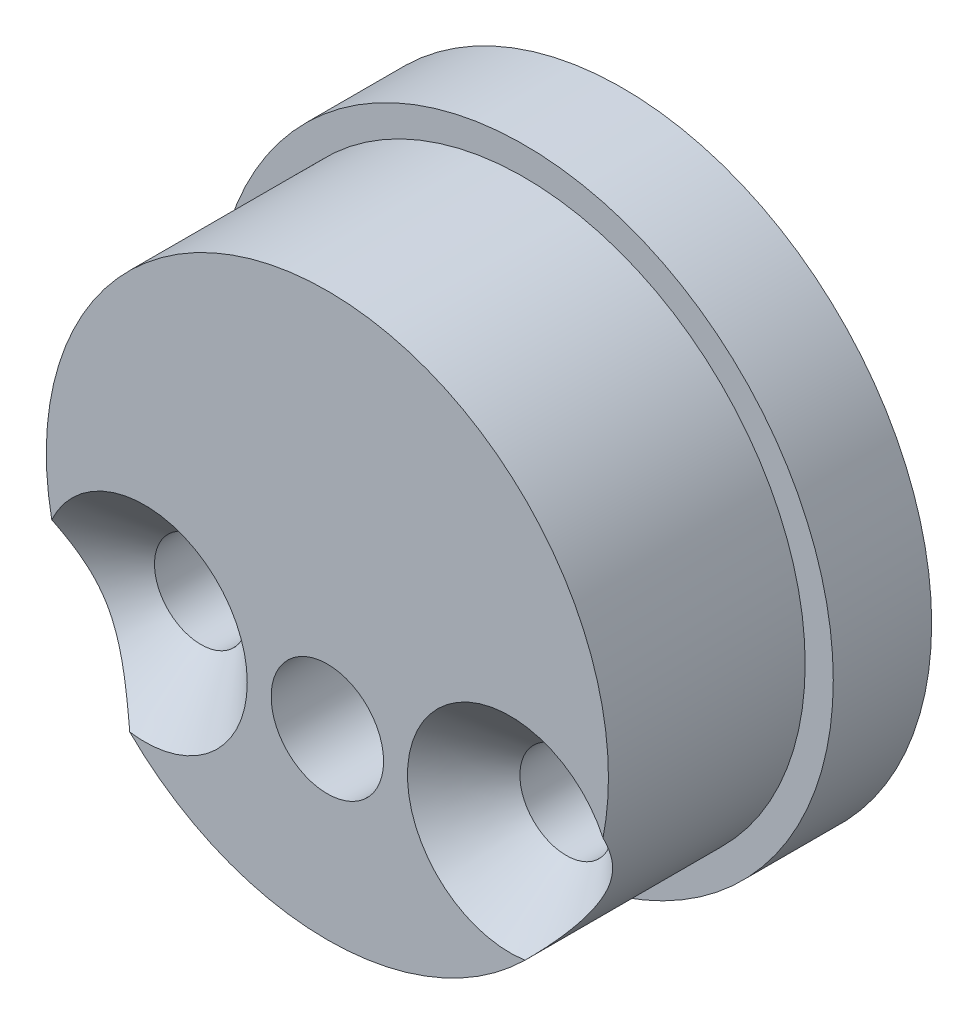
ISO-10303-21;
HEADER;
FILE_DESCRIPTION(('STEP AP214'),'2;1');
FILE_NAME('part.step','',(''),(''),'','','');
FILE_SCHEMA(('AUTOMOTIVE_DESIGN { 1 0 10303 214 1 1 1 1 }'));
ENDSEC;
DATA;
#1=APPLICATION_CONTEXT('core data for automotive mechanical design processes');
#2=APPLICATION_PROTOCOL_DEFINITION('international standard','automotive_design',2000,#1);
#3=PRODUCT_CONTEXT('',#1,'mechanical');
#4=PRODUCT('Part','Part','',(#3));
#5=PRODUCT_RELATED_PRODUCT_CATEGORY('part','',(#4));
#6=PRODUCT_DEFINITION_FORMATION('','',#4);
#7=PRODUCT_DEFINITION_CONTEXT('part definition',#1,'design');
#8=PRODUCT_DEFINITION('design','',#6,#7);
#9=PRODUCT_DEFINITION_SHAPE('','',#8);
#10=(LENGTH_UNIT() NAMED_UNIT(*) SI_UNIT(.MILLI.,.METRE.));
#11=(NAMED_UNIT(*) PLANE_ANGLE_UNIT() SI_UNIT($,.RADIAN.));
#12=(NAMED_UNIT(*) SI_UNIT($,.STERADIAN.) SOLID_ANGLE_UNIT());
#13=UNCERTAINTY_MEASURE_WITH_UNIT(LENGTH_MEASURE(1.E-05),#10,'distance_accuracy_value','');
#14=(GEOMETRIC_REPRESENTATION_CONTEXT(3) GLOBAL_UNCERTAINTY_ASSIGNED_CONTEXT((#13)) GLOBAL_UNIT_ASSIGNED_CONTEXT((#10,
#11,#12)) REPRESENTATION_CONTEXT('',''));
#15=CARTESIAN_POINT('',(0.,0.,0.));
#16=DIRECTION('',(0.,0.,1.));
#17=DIRECTION('',(1.,0.,0.));
#18=AXIS2_PLACEMENT_3D('',#15,#16,#17);
#19=CARTESIAN_POINT('',(0.,3.49999994784594,8.5));
#20=DIRECTION('',(0.,0.,1.));
#21=DIRECTION('',(1.,0.,0.));
#22=AXIS2_PLACEMENT_3D('',#19,#20,#21);
#23=PLANE('',#22);
#24=CARTESIAN_POINT('',(-6.50000009685755,0.,8.5));
#25=DIRECTION('',(0.,0.,1.));
#26=DIRECTION('',(-1.,0.,0.));
#27=AXIS2_PLACEMENT_3D('',#24,#25,#26);
#28=CIRCLE('',#27,1.65);
#29=CARTESIAN_POINT('',(-4.85000009685755,0.,8.5));
#30=VERTEX_POINT('',#29);
#31=EDGE_CURVE('E209',#30,#30,#28,.T.);
#32=ORIENTED_EDGE('',*,*,#31,.T.);
#33=EDGE_LOOP('',(#32));
#34=FACE_BOUND('',#33,.T.);
#35=CARTESIAN_POINT('',(6.50000009685755,0.,8.5));
#36=DIRECTION('',(0.,0.,1.));
#37=DIRECTION('',(-1.,0.,0.));
#38=AXIS2_PLACEMENT_3D('',#35,#36,#37);
#39=CIRCLE('',#38,1.65);
#40=CARTESIAN_POINT('',(8.15000009685755,0.,8.5));
#41=VERTEX_POINT('',#40);
#42=EDGE_CURVE('E238',#41,#41,#39,.T.);
#43=ORIENTED_EDGE('',*,*,#42,.T.);
#44=EDGE_LOOP('',(#43));
#45=FACE_BOUND('',#44,.T.);
#46=CARTESIAN_POINT('',(0.,0.,8.5));
#47=DIRECTION('',(0.,0.,1.));
#48=DIRECTION('',(-1.,0.,0.));
#49=AXIS2_PLACEMENT_3D('',#46,#47,#48);
#50=CIRCLE('',#49,2.);
#51=CARTESIAN_POINT('',(2.,0.,8.5));
#52=VERTEX_POINT('',#51);
#53=EDGE_CURVE('E233',#52,#52,#50,.T.);
#54=ORIENTED_EDGE('',*,*,#53,.T.);
#55=EDGE_LOOP('',(#54));
#56=FACE_BOUND('',#55,.T.);
#57=CARTESIAN_POINT('',(0.,3.49999994784594,8.5));
#58=DIRECTION('',(0.,0.,-1.));
#59=DIRECTION('',(-1.,0.,0.));
#60=AXIS2_PLACEMENT_3D('',#57,#58,#59);
#61=CIRCLE('',#60,11.);
#62=CARTESIAN_POINT('',(11.,3.49999994784594,8.5));
#63=VERTEX_POINT('',#62);
#64=EDGE_CURVE('E26',#63,#63,#61,.T.);
#65=ORIENTED_EDGE('',*,*,#64,.T.);
#66=EDGE_LOOP('',(#65));
#67=FACE_BOUND('',#66,.T.);
#68=ADVANCED_FACE('F15',(#34,#45,#56,#67),#23,.F.);
#69=CARTESIAN_POINT('',(0.,3.49999994784594,17.));
#70=DIRECTION('',(0.,0.,-1.));
#71=DIRECTION('',(-1.,0.,0.));
#72=AXIS2_PLACEMENT_3D('',#69,#70,#71);
#73=CYLINDRICAL_SURFACE('',#72,11.);
#74=ORIENTED_EDGE('',*,*,#64,.F.);
#75=DIRECTION('',(0.,0.,1.));
#76=VECTOR('',#75,1.);
#77=CARTESIAN_POINT('',(11.,3.49999994784594,17.));
#78=LINE('',#77,#76);
#79=CARTESIAN_POINT('',(11.,3.49999994784594,12.));
#80=VERTEX_POINT('',#79);
#81=EDGE_CURVE('E10',#63,#80,#78,.T.);
#82=ORIENTED_EDGE('',*,*,#81,.T.);
#83=CARTESIAN_POINT('',(0.,3.49999994784594,12.));
#84=DIRECTION('',(0.,0.,-1.));
#85=DIRECTION('',(-1.,0.,0.));
#86=AXIS2_PLACEMENT_3D('',#83,#84,#85);
#87=CIRCLE('',#86,11.);
#88=EDGE_CURVE('E230',#80,#80,#87,.T.);
#89=ORIENTED_EDGE('',*,*,#88,.T.);
#90=ORIENTED_EDGE('',*,*,#81,.F.);
#91=EDGE_LOOP('',(#74,#82,#89,#90));
#92=FACE_BOUND('',#91,.T.);
#93=ADVANCED_FACE('F178',(#92),#73,.T.);
#94=CARTESIAN_POINT('',(0.,3.49999994784594,12.));
#95=DIRECTION('',(0.,0.,-1.));
#96=DIRECTION('',(0.,-1.,0.));
#97=AXIS2_PLACEMENT_3D('',#94,#95,#96);
#98=PLANE('',#97);
#99=CARTESIAN_POINT('',(0.,3.49999994784594,12.));
#100=DIRECTION('',(0.,0.,-1.));
#101=DIRECTION('',(-1.,0.,0.));
#102=AXIS2_PLACEMENT_3D('',#99,#100,#101);
#103=CIRCLE('',#102,10.);
#104=CARTESIAN_POINT('',(10.,3.49999994784594,12.));
#105=VERTEX_POINT('',#104);
#106=EDGE_CURVE('E226',#105,#105,#103,.T.);
#107=ORIENTED_EDGE('',*,*,#106,.T.);
#108=EDGE_LOOP('',(#107));
#109=FACE_BOUND('',#108,.T.);
#110=ORIENTED_EDGE('',*,*,#88,.F.);
#111=EDGE_LOOP('',(#110));
#112=FACE_BOUND('',#111,.T.);
#113=ADVANCED_FACE('F141',(#109,#112),#98,.F.);
#114=CARTESIAN_POINT('',(0.,0.,20.));
#115=DIRECTION('',(0.,0.,-1.));
#116=DIRECTION('',(-1.,0.,0.));
#117=AXIS2_PLACEMENT_3D('',#114,#115,#116);
#118=CYLINDRICAL_SURFACE('',#117,2.);
#119=CARTESIAN_POINT('',(0.,0.,19.));
#120=DIRECTION('',(0.,0.,-1.));
#121=DIRECTION('',(-1.,0.,0.));
#122=AXIS2_PLACEMENT_3D('',#119,#120,#121);
#123=CIRCLE('',#122,2.);
#124=CARTESIAN_POINT('',(2.,0.,19.));
#125=VERTEX_POINT('',#124);
#126=EDGE_CURVE('E101',#125,#125,#123,.T.);
#127=ORIENTED_EDGE('',*,*,#126,.F.);
#128=DIRECTION('',(0.,0.,-1.));
#129=VECTOR('',#128,1.);
#130=CARTESIAN_POINT('',(2.,0.,20.));
#131=LINE('',#130,#129);
#132=EDGE_CURVE('E234',#125,#52,#131,.T.);
#133=ORIENTED_EDGE('',*,*,#132,.T.);
#134=ORIENTED_EDGE('',*,*,#53,.F.);
#135=ORIENTED_EDGE('',*,*,#132,.F.);
#136=EDGE_LOOP('',(#127,#133,#134,#135));
#137=FACE_BOUND('',#136,.T.);
#138=ADVANCED_FACE('F183',(#137),#118,.F.);
#139=CARTESIAN_POINT('',(6.50000009685755,0.,20.));
#140=DIRECTION('',(0.,0.,-1.));
#141=DIRECTION('',(-1.,0.,0.));
#142=AXIS2_PLACEMENT_3D('',#139,#140,#141);
#143=CYLINDRICAL_SURFACE('',#142,1.65);
#144=CARTESIAN_POINT('',(6.50000009685755,0.,17.));
#145=DIRECTION('',(0.,0.,-1.));
#146=DIRECTION('',(-1.,0.,0.));
#147=AXIS2_PLACEMENT_3D('',#144,#145,#146);
#148=CIRCLE('',#147,1.65);
#149=CARTESIAN_POINT('',(8.15000009685755,0.,17.));
#150=VERTEX_POINT('',#149);
#151=EDGE_CURVE('E202',#150,#150,#148,.T.);
#152=ORIENTED_EDGE('',*,*,#151,.F.);
#153=DIRECTION('',(0.,0.,-1.));
#154=VECTOR('',#153,1.);
#155=CARTESIAN_POINT('',(8.15000009685755,0.,20.));
#156=LINE('',#155,#154);
#157=EDGE_CURVE('E248',#150,#41,#156,.T.);
#158=ORIENTED_EDGE('',*,*,#157,.T.);
#159=ORIENTED_EDGE('',*,*,#42,.F.);
#160=ORIENTED_EDGE('',*,*,#157,.F.);
#161=EDGE_LOOP('',(#152,#158,#159,#160));
#162=FACE_BOUND('',#161,.T.);
#163=ADVANCED_FACE('F139',(#162),#143,.F.);
#164=CARTESIAN_POINT('',(0.,3.49999994784594,19.));
#165=DIRECTION('',(0.,0.,1.));
#166=DIRECTION('',(1.,0.,0.));
#167=AXIS2_PLACEMENT_3D('',#164,#165,#166);
#168=PLANE('',#167);
#169=ORIENTED_EDGE('',*,*,#126,.T.);
#170=EDGE_LOOP('',(#169));
#171=FACE_BOUND('',#170,.T.);
#172=CARTESIAN_POINT('',(-6.50000009685755,0.,19.));
#173=DIRECTION('',(0.,0.,1.));
#174=DIRECTION('',(-1.,0.,0.));
#175=AXIS2_PLACEMENT_3D('',#172,#173,#174);
#176=CIRCLE('',#175,3.65);
#177=CARTESIAN_POINT('',(-7.03069259099307,-3.61121385086348,19.));
#178=VERTEX_POINT('',#177);
#179=CARTESIAN_POINT('',(-2.85000009685755,0.,19.));
#180=VERTEX_POINT('',#179);
#181=EDGE_CURVE('E108',#178,#180,#176,.T.);
#182=ORIENTED_EDGE('',*,*,#181,.F.);
#183=CARTESIAN_POINT('',(0.,3.49999994784594,19.));
#184=DIRECTION('',(0.,0.,1.));
#185=DIRECTION('',(-1.,0.,0.));
#186=AXIS2_PLACEMENT_3D('',#183,#184,#185);
#187=CIRCLE('',#186,10.);
#188=CARTESIAN_POINT('',(7.03069259099307,-3.61121385086348,19.));
#189=VERTEX_POINT('',#188);
#190=EDGE_CURVE('E106',#178,#189,#187,.T.);
#191=ORIENTED_EDGE('',*,*,#190,.T.);
#192=CARTESIAN_POINT('',(6.50000009685755,0.,19.));
#193=DIRECTION('',(0.,0.,1.));
#194=DIRECTION('',(-1.,0.,0.));
#195=AXIS2_PLACEMENT_3D('',#192,#193,#194);
#196=CIRCLE('',#195,3.65);
#197=CARTESIAN_POINT('',(9.80699097655733,1.54476901884471,19.));
#198=VERTEX_POINT('',#197);
#199=EDGE_CURVE('E86',#198,#189,#196,.T.);
#200=ORIENTED_EDGE('',*,*,#199,.F.);
#201=CARTESIAN_POINT('',(0.,3.49999994784594,19.));
#202=DIRECTION('',(0.,0.,1.));
#203=DIRECTION('',(-1.,0.,0.));
#204=AXIS2_PLACEMENT_3D('',#201,#202,#203);
#205=CIRCLE('',#204,10.);
#206=CARTESIAN_POINT('',(10.,3.49999994784594,19.));
#207=VERTEX_POINT('',#206);
#208=EDGE_CURVE('E150',#198,#207,#205,.T.);
#209=ORIENTED_EDGE('',*,*,#208,.T.);
#210=CARTESIAN_POINT('',(0.,3.49999994784594,19.));
#211=DIRECTION('',(0.,0.,1.));
#212=DIRECTION('',(-1.,0.,0.));
#213=AXIS2_PLACEMENT_3D('',#210,#211,#212);
#214=CIRCLE('',#213,10.);
#215=CARTESIAN_POINT('',(-9.80699097655733,1.54476901884471,19.));
#216=VERTEX_POINT('',#215);
#217=EDGE_CURVE('E113',#207,#216,#214,.T.);
#218=ORIENTED_EDGE('',*,*,#217,.T.);
#219=CARTESIAN_POINT('',(-6.50000009685755,0.,19.));
#220=DIRECTION('',(0.,0.,1.));
#221=DIRECTION('',(-1.,0.,0.));
#222=AXIS2_PLACEMENT_3D('',#219,#220,#221);
#223=CIRCLE('',#222,3.65);
#224=EDGE_CURVE('E224',#180,#216,#223,.T.);
#225=ORIENTED_EDGE('',*,*,#224,.F.);
#226=EDGE_LOOP('',(#182,#191,#200,#209,#218,#225));
#227=FACE_BOUND('',#226,.T.);
#228=ADVANCED_FACE('F17',(#171,#227),#168,.T.);
#229=CARTESIAN_POINT('',(6.50000009685755,0.,18.));
#230=DIRECTION('',(0.,0.,1.));
#231=DIRECTION('',(-1.,0.,0.));
#232=AXIS2_PLACEMENT_3D('',#229,#230,#231);
#233=CONICAL_SURFACE('',#232,2.65,0.785398163397448);
#234=ORIENTED_EDGE('',*,*,#151,.T.);
#235=DIRECTION('',(0.707106781186548,0.,0.707106781186547));
#236=VECTOR('',#235,1.);
#237=CARTESIAN_POINT('',(9.15000009685755,0.,18.));
#238=LINE('',#237,#236);
#239=CARTESIAN_POINT('',(9.36749701725732,2.31887718719516E-10,18.2174969203998));
#240=VERTEX_POINT('',#239);
#241=EDGE_CURVE('E102',#150,#240,#238,.T.);
#242=ORIENTED_EDGE('',*,*,#241,.T.);
#243=CARTESIAN_POINT('',(9.36749701725734,4.63780830473763E-10,18.2174969203998));
#244=CARTESIAN_POINT('',(9.38939796476315,0.0586190476811844,18.2394018523596));
#245=CARTESIAN_POINT('',(9.41062062970764,0.117065788977279,18.2624182724748));
#246=CARTESIAN_POINT('',(9.4523610157498,0.235368112130509,18.31114604873));
#247=CARTESIAN_POINT('',(9.47283833281973,0.295213192207922,18.3369176411006));
#248=CARTESIAN_POINT('',(9.51306922226458,0.416480835223329,18.3911493784823));
#249=CARTESIAN_POINT('',(9.53277755018191,0.477891349586902,18.4196697262929));
#250=CARTESIAN_POINT('',(9.57143071164807,0.602444792039658,18.4794010472463));
#251=CARTESIAN_POINT('',(9.59032610353472,0.665574814288081,18.5106707782029));
#252=CARTESIAN_POINT('',(9.6272971196398,0.793700644461552,18.5759023933475));
#253=CARTESIAN_POINT('',(9.64531976802298,0.858683054090566,18.6099204546262));
#254=CARTESIAN_POINT('',(9.68047743617784,0.99062640323917,18.6806522842539));
#255=CARTESIAN_POINT('',(9.69755664346019,1.05757373195101,18.7174190652025));
#256=CARTESIAN_POINT('',(9.73075236374484,1.19353896982105,18.793649716336));
#257=CARTESIAN_POINT('',(9.74681093792722,1.26254320502882,18.8331630479949));
#258=CARTESIAN_POINT('',(9.77788788590503,1.40269220510062,18.9148982804694));
#259=CARTESIAN_POINT('',(9.79284693063206,1.47382321066004,18.9571664049817));
#260=CARTESIAN_POINT('',(9.80699097655733,1.54476901884471,19.));
#261=B_SPLINE_CURVE_WITH_KNOTS('',3,(#243,#244,#245,#246,#247,#248,#249,#250,#251,#252,#253,
#254,#255,#256,#257,#258,#259,#260),.UNSPECIFIED.,.F.,.F.,(4,2,2,2,2,2,2,2,4),(0.,
0.198873289640602,0.403728378108822,0.615250583277233,0.834034712725423,1.06059186877625,
1.29535687494956,1.53869576559323,1.79091297492964),.UNSPECIFIED.);
#262=EDGE_CURVE('E95',#240,#198,#261,.T.);
#263=ORIENTED_EDGE('',*,*,#262,.T.);
#264=ORIENTED_EDGE('',*,*,#199,.T.);
#265=CARTESIAN_POINT('',(7.03069259099308,-3.61121385086347,19.));
#266=CARTESIAN_POINT('',(7.12223727816837,-3.52071206542532,18.9238511591986));
#267=CARTESIAN_POINT('',(7.2128616242026,-3.42775380585674,18.8494018359008));
#268=CARTESIAN_POINT('',(7.38659517874963,-3.24234218658472,18.7097827972107));
#269=CARTESIAN_POINT('',(7.46982179528158,-3.15021535919636,18.6443239272914));
#270=CARTESIAN_POINT('',(7.62945598986854,-2.96651916346832,18.5226197362275));
#271=CARTESIAN_POINT('',(7.70597037476731,-2.87525688622496,18.4660561592734));
#272=CARTESIAN_POINT('',(7.81782148587514,-2.73674823945068,18.3870684945928));
#273=CARTESIAN_POINT('',(7.85380630697033,-2.69139002651901,18.3622347809948));
#274=CARTESIAN_POINT('',(7.92440049591057,-2.60078235036921,18.3148479804504));
#275=CARTESIAN_POINT('',(7.95902046141154,-2.55556425312223,18.2922509359168));
#276=CARTESIAN_POINT('',(8.0269953466458,-2.46517961152329,18.2493375778969));
#277=CARTESIAN_POINT('',(8.06036003020234,-2.42004107989894,18.2289778374524));
#278=CARTESIAN_POINT('',(8.12593614763572,-2.32973734682482,18.190539250305));
#279=CARTESIAN_POINT('',(8.15815650734595,-2.28459635335624,18.1724188956067));
#280=CARTESIAN_POINT('',(8.22154559133992,-2.19418665502011,18.1384527934407));
#281=CARTESIAN_POINT('',(8.25272253243895,-2.1489379497811,18.1225692972566));
#282=CARTESIAN_POINT('',(8.3141353325224,-2.05819747548603,18.0930867280534));
#283=CARTESIAN_POINT('',(8.34437827265038,-2.01272101778681,18.0794553404735));
#284=CARTESIAN_POINT('',(8.40854014318084,-1.91433035398362,18.0524937253455));
#285=CARTESIAN_POINT('',(8.44237421357903,-1.86127367014135,18.0394786007338));
#286=CARTESIAN_POINT('',(8.50844550359467,-1.7553445329995,18.0167233921444));
#287=CARTESIAN_POINT('',(8.54070153560859,-1.70249947375937,18.0069108160628));
#288=CARTESIAN_POINT('',(8.60392601618027,-1.59678304837209,17.9905602754948));
#289=CARTESIAN_POINT('',(8.63490703684891,-1.5439274514579,17.9839693981883));
#290=CARTESIAN_POINT('',(8.69582085638157,-1.4379215929919,17.9740364830326));
#291=CARTESIAN_POINT('',(8.72576038628778,-1.3847777927489,17.9706669457916));
#292=CARTESIAN_POINT('',(8.7847780933179,-1.27788165559708,17.9671485307183));
#293=CARTESIAN_POINT('',(8.81385593949896,-1.22412909556461,17.9670008746912));
#294=CARTESIAN_POINT('',(8.87128279277304,-1.1156662747532,17.9699032826333));
#295=CARTESIAN_POINT('',(8.89962221305858,-1.06095176894696,17.9729838345208));
#296=CARTESIAN_POINT('',(8.95469961285086,-0.951966509781761,17.9821353580737));
#297=CARTESIAN_POINT('',(8.98145479303433,-0.89770073565918,17.9881625645869));
#298=CARTESIAN_POINT('',(9.03386784966949,-0.788846860074156,18.003141814132));
#299=CARTESIAN_POINT('',(9.05952230726684,-0.734258280171671,18.0121023154042));
#300=CARTESIAN_POINT('',(9.10992014590992,-0.624515286363899,18.0329326228304));
#301=CARTESIAN_POINT('',(9.13465139303711,-0.569360846612338,18.0448314974614));
#302=CARTESIAN_POINT('',(9.18332755658859,-0.458224976978021,18.0715168708875));
#303=CARTESIAN_POINT('',(9.20725175581572,-0.402245558788706,18.086349328376));
#304=CARTESIAN_POINT('',(9.25438986901565,-0.289199317411909,18.118886476505));
#305=CARTESIAN_POINT('',(9.27757458399932,-0.23213726716344,18.1366496313397));
#306=CARTESIAN_POINT('',(9.32326341910195,-0.116660826494475,18.1750383162784));
#307=CARTESIAN_POINT('',(9.34572996751907,-0.0582536232467119,18.1957303846295));
#308=CARTESIAN_POINT('',(9.36749701725734,4.63780830473763E-10,18.2174969203998));
#309=B_SPLINE_CURVE_WITH_KNOTS('',3,(#265,#266,#267,#268,#269,#270,#271,#272,#273,#274,#275,
#276,#277,#278,#279,#280,#281,#282,#283,#284,#285,#286,#287,#288,#289,#290,#291,#292,#293,#294,
#295,#296,#297,#298,#299,#300,#301,#302,#303,#304,#305,#306,#307,#308),.UNSPECIFIED.,.F.,.F.,(4,
2,2,2,2,2,2,2,2,2,2,2,2,2,2,2,2,2,2,2,2,4),(0.,0.448742669533729,0.869642759131588,
1.26493532926555,1.45390869898327,1.63768099113825,1.81677326775803,1.99177065257497,
2.16332380832491,2.33214852269032,2.52484397477648,2.71281356998964,2.89758255205186,
3.08075976092854,3.26400643325484,3.44899945991167,3.63132472250976,3.81418042574609,
3.99892311698259,4.18682935253428,4.37907883056525,4.57674408664639),.UNSPECIFIED.);
#310=EDGE_CURVE('E92',#189,#240,#309,.T.);
#311=ORIENTED_EDGE('',*,*,#310,.T.);
#312=ORIENTED_EDGE('',*,*,#241,.F.);
#313=EDGE_LOOP('',(#234,#242,#263,#264,#311,#312));
#314=FACE_BOUND('',#313,.T.);
#315=ADVANCED_FACE('F89',(#314),#233,.F.);
#316=CARTESIAN_POINT('',(-6.50000009685755,0.,20.));
#317=DIRECTION('',(0.,0.,-1.));
#318=DIRECTION('',(-1.,0.,0.));
#319=AXIS2_PLACEMENT_3D('',#316,#317,#318);
#320=CYLINDRICAL_SURFACE('',#319,1.65);
#321=CARTESIAN_POINT('',(-6.50000009685755,0.,17.));
#322=DIRECTION('',(0.,0.,-1.));
#323=DIRECTION('',(-1.,0.,0.));
#324=AXIS2_PLACEMENT_3D('',#321,#322,#323);
#325=CIRCLE('',#324,1.65);
#326=CARTESIAN_POINT('',(-4.85000009685755,0.,17.));
#327=VERTEX_POINT('',#326);
#328=EDGE_CURVE('E220',#327,#327,#325,.T.);
#329=ORIENTED_EDGE('',*,*,#328,.F.);
#330=DIRECTION('',(0.,0.,-1.));
#331=VECTOR('',#330,1.);
#332=CARTESIAN_POINT('',(-4.85000009685755,0.,20.));
#333=LINE('',#332,#331);
#334=EDGE_CURVE('E215',#327,#30,#333,.T.);
#335=ORIENTED_EDGE('',*,*,#334,.T.);
#336=ORIENTED_EDGE('',*,*,#31,.F.);
#337=ORIENTED_EDGE('',*,*,#334,.F.);
#338=EDGE_LOOP('',(#329,#335,#336,#337));
#339=FACE_BOUND('',#338,.T.);
#340=ADVANCED_FACE('F138',(#339),#320,.F.);
#341=CARTESIAN_POINT('',(0.,3.49999994784594,17.));
#342=DIRECTION('',(0.,0.,-1.));
#343=DIRECTION('',(-1.,0.,0.));
#344=AXIS2_PLACEMENT_3D('',#341,#342,#343);
#345=CYLINDRICAL_SURFACE('',#344,10.);
#346=ORIENTED_EDGE('',*,*,#106,.F.);
#347=DIRECTION('',(0.,0.,1.));
#348=VECTOR('',#347,1.);
#349=CARTESIAN_POINT('',(10.,3.49999994784594,17.));
#350=LINE('',#349,#348);
#351=EDGE_CURVE('E158',#105,#207,#350,.T.);
#352=ORIENTED_EDGE('',*,*,#351,.T.);
#353=ORIENTED_EDGE('',*,*,#208,.F.);
#354=ORIENTED_EDGE('',*,*,#262,.F.);
#355=ORIENTED_EDGE('',*,*,#310,.F.);
#356=ORIENTED_EDGE('',*,*,#190,.F.);
#357=CARTESIAN_POINT('',(-9.80699097655733,1.54476901884473,19.));
#358=CARTESIAN_POINT('',(-9.78216059700042,1.42019338657213,18.9248567757669));
#359=CARTESIAN_POINT('',(-9.75481082591005,1.29505927441754,18.8513498952394));
#360=CARTESIAN_POINT('',(-9.69648443603138,1.05127067891361,18.7133747827492));
#361=CARTESIAN_POINT('',(-9.6658365960133,0.932693908067128,18.6486287040048));
#362=CARTESIAN_POINT('',(-9.60136047622639,0.701492996298004,18.5281203001359));
#363=CARTESIAN_POINT('',(-9.56783852885717,0.588944863907456,18.4720511593397));
#364=CARTESIAN_POINT('',(-9.49797615526529,0.369038806578075,18.3689423742232));
#365=CARTESIAN_POINT('',(-9.46190742970381,0.261753172443189,18.3215693764738));
#366=CARTESIAN_POINT('',(-9.40540222619183,0.102714844504946,18.256785668786));
#367=CARTESIAN_POINT('',(-9.386715508512,0.0514171264594918,18.2367155082415));
#368=CARTESIAN_POINT('',(-9.35591385101511,-0.030989589799994,18.2059136959436));
#369=CARTESIAN_POINT('',(-9.34413751309661,-0.062022555747992,18.1946398124136));
#370=CARTESIAN_POINT('',(-9.32037603914295,-0.123662206924204,18.1729161129659));
#371=CARTESIAN_POINT('',(-9.30839730289787,-0.154267725241481,18.1624559631697));
#372=CARTESIAN_POINT('',(-9.27270828972794,-0.244124599248601,18.1327739947394));
#373=CARTESIAN_POINT('',(-9.24847344979546,-0.303477890022354,18.1144765081346));
#374=CARTESIAN_POINT('',(-9.19918640236071,-0.420980261473027,18.0811429389625));
#375=CARTESIAN_POINT('',(-9.17416766219694,-0.479124145886527,18.0660392530442));
#376=CARTESIAN_POINT('',(-9.12325186727992,-0.594507614102067,18.0390819817589));
#377=CARTESIAN_POINT('',(-9.09737801126126,-0.651745109053498,18.0271758876799));
#378=CARTESIAN_POINT('',(-9.04462809105532,-0.765615943027929,18.0065973235081));
#379=CARTESIAN_POINT('',(-9.01776502936236,-0.822249456865369,17.9978929372472));
#380=CARTESIAN_POINT('',(-8.98013303954678,-0.899647594238005,17.9881608174524));
#381=CARTESIAN_POINT('',(-8.9698994935435,-0.920506313769247,17.9857539265508));
#382=CARTESIAN_POINT('',(-8.94925900061107,-0.962193469164903,17.9813778220851));
#383=CARTESIAN_POINT('',(-8.9388519928032,-0.983021891483715,17.9794087658165));
#384=CARTESIAN_POINT('',(-8.90962636917289,-1.04095464669671,17.9745316184188));
#385=CARTESIAN_POINT('',(-8.89061609625887,-1.07800389651008,17.972099331304));
#386=CARTESIAN_POINT('',(-8.85226621171017,-1.15154963867901,17.968686829197));
#387=CARTESIAN_POINT('',(-8.8329314227685,-1.18804804325429,17.9676930832573));
#388=CARTESIAN_POINT('',(-8.78249703184149,-1.28185289133974,17.9670009829932));
#389=CARTESIAN_POINT('',(-8.75105775122348,-1.33899095023238,17.9683835765682));
#390=CARTESIAN_POINT('',(-8.70318558138828,-1.42412345057735,17.9731839790083));
#391=CARTESIAN_POINT('',(-8.68710968348526,-1.4524045610561,17.9752384555355));
#392=CARTESIAN_POINT('',(-8.65467943322814,-1.50885243198022,17.9802514382266));
#393=CARTESIAN_POINT('',(-8.63832433560267,-1.5370185045735,17.9832129127513));
#394=CARTESIAN_POINT('',(-8.60120077103979,-1.60027822123052,17.9908873966984));
#395=CARTESIAN_POINT('',(-8.58037121943549,-1.63530531756407,17.9958545286894));
#396=CARTESIAN_POINT('',(-8.53816732371392,-1.70533414492336,18.0071851616658));
#397=CARTESIAN_POINT('',(-8.51678951149755,-1.74033139714232,18.0135633593028));
#398=CARTESIAN_POINT('',(-8.47341436797592,-1.81037447217424,18.0277133871262));
#399=CARTESIAN_POINT('',(-8.45141254841045,-1.84541371129323,18.0355039958937));
#400=CARTESIAN_POINT('',(-8.40669772769299,-1.91560089253088,18.0524681413525));
#401=CARTESIAN_POINT('',(-8.38397902556135,-1.95073988462621,18.0616636136606));
#402=CARTESIAN_POINT('',(-8.33781528568809,-2.02111367293862,18.0814395081194));
#403=CARTESIAN_POINT('',(-8.314364561995,-2.05633848053811,18.0920421725806));
#404=CARTESIAN_POINT('',(-8.26691058529376,-2.12666308721239,18.1145931104296));
#405=CARTESIAN_POINT('',(-8.24290408984828,-2.16175581969971,18.1265565473752));
#406=CARTESIAN_POINT('',(-8.18617242496516,-2.24357938169202,18.1560361296491));
#407=CARTESIAN_POINT('',(-8.1533460366006,-2.29006946836234,18.1740268743422));
#408=CARTESIAN_POINT('',(-8.08651864018126,-2.3830647421286,18.2123519034922));
#409=CARTESIAN_POINT('',(-8.05250819540973,-2.42954438478672,18.2327314806344));
#410=CARTESIAN_POINT('',(-7.98318927110027,-2.52261940094759,18.2758296208263));
#411=CARTESIAN_POINT('',(-7.94787037111575,-2.56918476900908,18.2985960855559));
#412=CARTESIAN_POINT('',(-7.87581076258095,-2.66250682440419,18.3464664532642));
#413=CARTESIAN_POINT('',(-7.83905860619071,-2.70922957409239,18.3716191261404));
#414=CARTESIAN_POINT('',(-7.76400874395547,-2.80292040853912,18.4242608975582));
#415=CARTESIAN_POINT('',(-7.72569843834774,-2.84985122182674,18.4517982466276));
#416=CARTESIAN_POINT('',(-7.64741491140986,-2.94399035344929,18.5092131415614));
#417=CARTESIAN_POINT('',(-7.60742797440866,-2.99115857871891,18.5391375654607));
#418=CARTESIAN_POINT('',(-7.48273245253397,-3.13549863475709,18.6339761227555));
#419=CARTESIAN_POINT('',(-7.397263521244,-3.23053962838275,18.7011352425539));
#420=CARTESIAN_POINT('',(-7.2185137201913,-3.42191426712904,18.8447282308153));
#421=CARTESIAN_POINT('',(-7.1251004363007,-3.5178855301597,18.9214823114382));
#422=CARTESIAN_POINT('',(-7.03069259099308,-3.61121385086347,19.));
#423=B_SPLINE_CURVE_WITH_KNOTS('',3,(#357,#358,#359,#360,#361,#362,#363,#364,#365,#366,#367,
#368,#369,#370,#371,#372,#373,#374,#375,#376,#377,#378,#379,#380,#381,#382,#383,#384,#385,#386,
#387,#388,#389,#390,#391,#392,#393,#394,#395,#396,#397,#398,#399,#400,#401,#402,#403,#404,#405,
#406,#407,#408,#409,#410,#411,#412,#413,#414,#415,#416,#417,#418,#419,#420,#421,#422),
.UNSPECIFIED.,.F.,.F.,(4,2,2,2,2,2,2,2,2,2,2,2,2,2,2,2,2,2,2,2,2,2,2,2,2,2,2,2,2,2,2,2,4),(0.,
0.442823170627149,0.858268227332226,1.2484742196715,1.61631323356366,1.79078485290189,
1.89594055271115,1.99940582302069,2.19934186229869,2.39449042190681,2.58620541061662,
2.7759538837721,2.84602483168844,2.91612091258172,3.0412282374186,3.16515097792864,
3.36071206059642,3.45848823626529,3.55658788984885,3.67972377392946,3.80420818553578,
3.93048855347535,4.05899251570888,4.18984530635451,4.32233377050982,4.50134866333566,
4.68458893922062,4.87271867704695,5.06632844100502,5.26593837648766,5.47200252367276,
5.90497174624866,6.36778231150126),.UNSPECIFIED.);
#424=EDGE_CURVE('E164',#216,#178,#423,.T.);
#425=ORIENTED_EDGE('',*,*,#424,.F.);
#426=ORIENTED_EDGE('',*,*,#217,.F.);
#427=ORIENTED_EDGE('',*,*,#351,.F.);
#428=EDGE_LOOP('',(#346,#352,#353,#354,#355,#356,#425,#426,#427));
#429=FACE_BOUND('',#428,.T.);
#430=ADVANCED_FACE('F117',(#429),#345,.T.);
#431=CARTESIAN_POINT('',(-6.50000009685755,0.,18.));
#432=DIRECTION('',(0.,0.,1.));
#433=DIRECTION('',(-1.,0.,0.));
#434=AXIS2_PLACEMENT_3D('',#431,#432,#433);
#435=CONICAL_SURFACE('',#434,2.65,0.785398163397448);
#436=ORIENTED_EDGE('',*,*,#424,.T.);
#437=ORIENTED_EDGE('',*,*,#181,.T.);
#438=DIRECTION('',(-0.707106781186548,0.,-0.707106781186547));
#439=VECTOR('',#438,1.);
#440=CARTESIAN_POINT('',(-3.85000009685755,0.,18.));
#441=LINE('',#440,#439);
#442=EDGE_CURVE('E225',#180,#327,#441,.T.);
#443=ORIENTED_EDGE('',*,*,#442,.T.);
#444=ORIENTED_EDGE('',*,*,#328,.T.);
#445=ORIENTED_EDGE('',*,*,#442,.F.);
#446=ORIENTED_EDGE('',*,*,#224,.T.);
#447=EDGE_LOOP('',(#436,#437,#443,#444,#445,#446));
#448=FACE_BOUND('',#447,.T.);
#449=ADVANCED_FACE('F137',(#448),#435,.F.);
#450=CLOSED_SHELL('',(#68,#93,#113,#138,#163,#228,#315,#340,#430,#449));
#451=MANIFOLD_SOLID_BREP('B1',#450);
#452=ADVANCED_BREP_SHAPE_REPRESENTATION('',(#18,#451),#14);
#453=SHAPE_DEFINITION_REPRESENTATION(#9,#452);
ENDSEC;
END-ISO-10303-21;
